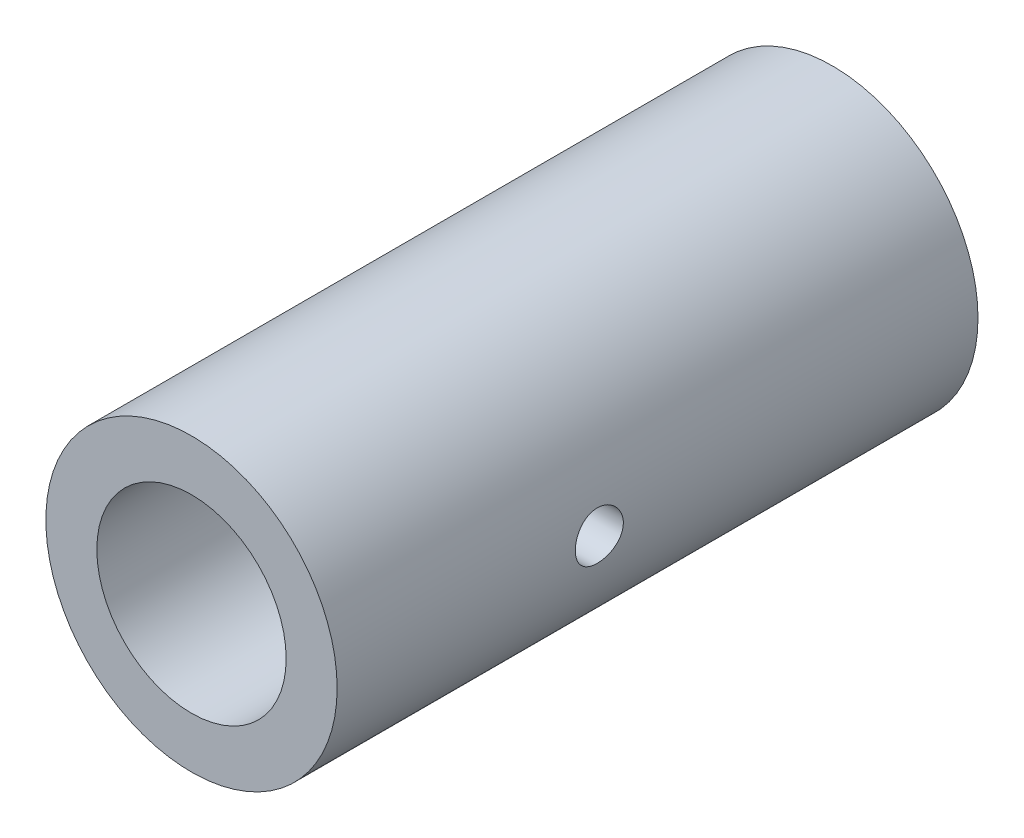
ISO-10303-21;
HEADER;
FILE_DESCRIPTION(('STEP AP214'),'2;1');
FILE_NAME('part.step','',(''),(''),'','','');
FILE_SCHEMA(('AUTOMOTIVE_DESIGN { 1 0 10303 214 1 1 1 1 }'));
ENDSEC;
DATA;
#1=APPLICATION_CONTEXT('core data for automotive mechanical design processes');
#2=APPLICATION_PROTOCOL_DEFINITION('international standard','automotive_design',2000,#1);
#3=PRODUCT_CONTEXT('',#1,'mechanical');
#4=PRODUCT('Part','Part','',(#3));
#5=PRODUCT_RELATED_PRODUCT_CATEGORY('part','',(#4));
#6=PRODUCT_DEFINITION_FORMATION('','',#4);
#7=PRODUCT_DEFINITION_CONTEXT('part definition',#1,'design');
#8=PRODUCT_DEFINITION('design','',#6,#7);
#9=PRODUCT_DEFINITION_SHAPE('','',#8);
#10=(LENGTH_UNIT() NAMED_UNIT(*) SI_UNIT(.MILLI.,.METRE.));
#11=(NAMED_UNIT(*) PLANE_ANGLE_UNIT() SI_UNIT($,.RADIAN.));
#12=(NAMED_UNIT(*) SI_UNIT($,.STERADIAN.) SOLID_ANGLE_UNIT());
#13=UNCERTAINTY_MEASURE_WITH_UNIT(LENGTH_MEASURE(1.E-05),#10,'distance_accuracy_value','');
#14=(GEOMETRIC_REPRESENTATION_CONTEXT(3) GLOBAL_UNCERTAINTY_ASSIGNED_CONTEXT((#13)) GLOBAL_UNIT_ASSIGNED_CONTEXT((#10,
#11,#12)) REPRESENTATION_CONTEXT('',''));
#15=CARTESIAN_POINT('',(0.,0.,0.));
#16=DIRECTION('',(0.,0.,1.));
#17=DIRECTION('',(1.,0.,0.));
#18=AXIS2_PLACEMENT_3D('',#15,#16,#17);
#19=CARTESIAN_POINT('',(0.,0.,44.));
#20=DIRECTION('',(0.,0.,-1.));
#21=DIRECTION('',(-1.,0.,0.));
#22=AXIS2_PLACEMENT_3D('',#19,#20,#21);
#23=CYLINDRICAL_SURFACE('',#22,10.);
#24=CARTESIAN_POINT('',(10.,0.,27.65));
#25=CARTESIAN_POINT('',(9.99999843258099,0.092011453105751,27.6499962990147));
#26=CARTESIAN_POINT('',(9.99871684765511,0.184073454347172,27.6422775413146));
#27=CARTESIAN_POINT('',(9.99372775496381,0.365616322535328,27.6116187648621));
#28=CARTESIAN_POINT('',(9.9900180027216,0.455094721351767,27.5886646630412));
#29=CARTESIAN_POINT('',(9.98058875631552,0.628817487751612,27.5282463610641));
#30=CARTESIAN_POINT('',(9.974870893487,0.713066038744482,27.4907939364397));
#31=CARTESIAN_POINT('',(9.96205444853338,0.874072236504037,27.4024727458514));
#32=CARTESIAN_POINT('',(9.95495602786423,0.950830757653324,27.351605548495));
#33=CARTESIAN_POINT('',(9.9400912001718,1.09540879372212,27.2373912228671));
#34=CARTESIAN_POINT('',(9.93231968689365,1.16314787882339,27.1739429363817));
#35=CARTESIAN_POINT('',(9.9170237472334,1.28706950777735,27.0365852264068));
#36=CARTESIAN_POINT('',(9.90949933632427,1.34325132909588,26.9626751493568));
#37=CARTESIAN_POINT('',(9.89550007731641,1.44278500045253,26.8059406563233));
#38=CARTESIAN_POINT('',(9.88903182722124,1.48605749570898,26.7230652056561));
#39=CARTESIAN_POINT('',(9.87794796970923,1.55803674048924,26.5510973747635));
#40=CARTESIAN_POINT('',(9.8733322397089,1.58674445381555,26.4620054063507));
#41=CARTESIAN_POINT('',(9.86652679242373,1.62852619503009,26.280985417999));
#42=CARTESIAN_POINT('',(9.86431555933323,1.64173895927951,26.1890902443212));
#43=CARTESIAN_POINT('',(9.86250435770823,1.65258585530686,26.0043626340766));
#44=CARTESIAN_POINT('',(9.86290420804218,1.65022106770359,25.9115302629694));
#45=CARTESIAN_POINT('',(9.86625034802632,1.63009303176277,25.7285527229433));
#46=CARTESIAN_POINT('',(9.86917088684506,1.61248549472487,25.6383898859726));
#47=CARTESIAN_POINT('',(9.87718903199043,1.56261607367809,25.4623159294666));
#48=CARTESIAN_POINT('',(9.88228671162733,1.53035369619838,25.3764049532117));
#49=CARTESIAN_POINT('',(9.89411264039674,1.45193210975571,25.2108064700756));
#50=CARTESIAN_POINT('',(9.90084846298694,1.4057081060585,25.1311502107593));
#51=CARTESIAN_POINT('',(9.9151864393107,1.30072141548377,24.9806656760923));
#52=CARTESIAN_POINT('',(9.92278866158316,1.24195773629986,24.9098381000877));
#53=CARTESIAN_POINT('',(9.93811607123993,1.11271072676602,24.7781200211173));
#54=CARTESIAN_POINT('',(9.94584163094155,1.04209376928223,24.7173606053701));
#55=CARTESIAN_POINT('',(9.96045987838133,0.891597059898564,24.6085339783937));
#56=CARTESIAN_POINT('',(9.9673525609492,0.811717250503356,24.5604668459529));
#57=CARTESIAN_POINT('',(9.97953794169528,0.644840083170753,24.4783778494657));
#58=CARTESIAN_POINT('',(9.98482933722619,0.557837003156559,24.444367412362));
#59=CARTESIAN_POINT('',(9.99320544362233,0.379246930002471,24.3914780872247));
#60=CARTESIAN_POINT('',(9.99629033536768,0.287660313260821,24.3725979588552));
#61=CARTESIAN_POINT('',(9.99988156603306,0.103632983819161,24.3506825388388));
#62=CARTESIAN_POINT('',(10.0004171933872,0.0112142564118359,24.3474672638785));
#63=CARTESIAN_POINT('',(9.99892971175882,-0.17284150555468,24.3564931986803));
#64=CARTESIAN_POINT('',(9.99690669920295,-0.264478569441162,24.3687338259605));
#65=CARTESIAN_POINT('',(9.99054737820398,-0.443814955541767,24.4081744027771));
#66=CARTESIAN_POINT('',(9.98622483070291,-0.5315343719383,24.4352853943084));
#67=CARTESIAN_POINT('',(9.97574921956607,-0.70118295929459,24.5036023925551));
#68=CARTESIAN_POINT('',(9.96959605484327,-0.783111810188987,24.5448091776617));
#69=CARTESIAN_POINT('',(9.95606928426946,-0.939636398877248,24.640561319499));
#70=CARTESIAN_POINT('',(9.94868555427359,-1.01416235726447,24.6952192859171));
#71=CARTESIAN_POINT('',(9.93354765732487,-1.15304841333208,24.8161671490688));
#72=CARTESIAN_POINT('',(9.92579346406183,-1.21740778758216,24.8824578728543));
#73=CARTESIAN_POINT('',(9.91069407401676,-1.33479962911471,25.0255961063283));
#74=CARTESIAN_POINT('',(9.90335382329476,-1.38771058951943,25.1025438710988));
#75=CARTESIAN_POINT('',(9.89000528724129,-1.47985547415616,25.2643410470675));
#76=CARTESIAN_POINT('',(9.88399696030451,-1.51908982562647,25.3491902113319));
#77=CARTESIAN_POINT('',(9.87402953570153,-1.58258535747086,25.5240395324032));
#78=CARTESIAN_POINT('',(9.87006212213643,-1.60690737863648,25.6140170997967));
#79=CARTESIAN_POINT('',(9.86460473721113,-1.64007952798875,25.7968513117806));
#80=CARTESIAN_POINT('',(9.86311455516768,-1.64893097191818,25.8897077108482));
#81=CARTESIAN_POINT('',(9.86278931217107,-1.65087457438795,26.0744506413018));
#82=CARTESIAN_POINT('',(9.86392203182987,-1.64415796786953,26.1663351601921));
#83=CARTESIAN_POINT('',(9.86864441177183,-1.61556925478546,26.3476477518639));
#84=CARTESIAN_POINT('',(9.87223406454433,-1.59369719454886,26.4370758321536));
#85=CARTESIAN_POINT('',(9.88145370519205,-1.53549112071356,26.6108652424354));
#86=CARTESIAN_POINT('',(9.88708141498759,-1.49917324977365,26.695232107451));
#87=CARTESIAN_POINT('',(9.89974533231771,-1.41312606218934,26.8567062668603));
#88=CARTESIAN_POINT('',(9.90678160742252,-1.36339610211421,26.9338132127277));
#89=CARTESIAN_POINT('',(9.92157214136343,-1.25125259966706,27.0795454976377));
#90=CARTESIAN_POINT('',(9.92933379899765,-1.18869826623126,27.1480617598196));
#91=CARTESIAN_POINT('',(9.94464125601211,-1.05297867490409,27.2736905998767));
#92=CARTESIAN_POINT('',(9.95218700513286,-0.979810970092669,27.3308005407802));
#93=CARTESIAN_POINT('',(9.96627143049842,-0.824354696103044,27.4323474225735));
#94=CARTESIAN_POINT('',(9.97280295936929,-0.742007852048185,27.476696147978));
#95=CARTESIAN_POINT('',(9.98405342047581,-0.570959586923793,27.5508633528063));
#96=CARTESIAN_POINT('',(9.98877416450827,-0.482264623543761,27.5806963641252));
#97=CARTESIAN_POINT('',(9.99483601455804,-0.327682758240928,27.6184793415268));
#98=CARTESIAN_POINT('',(9.99676220083327,-0.2627330667111,27.6302807488145));
#99=CARTESIAN_POINT('',(9.99934474465587,-0.131864227625941,27.6460423389331));
#100=CARTESIAN_POINT('',(10.0000011233775,-0.0659450962546689,27.6500026525158));
#101=CARTESIAN_POINT('',(10.,0.,27.65));
#102=B_SPLINE_CURVE_WITH_KNOTS('',3,(#24,#25,#26,#27,#28,#29,#30,#31,#32,#33,#34,#35,#36,#37,
#38,#39,#40,#41,#42,#43,#44,#45,#46,#47,#48,#49,#50,#51,#52,#53,#54,#55,#56,#57,#58,#59,#60,#61,
#62,#63,#64,#65,#66,#67,#68,#69,#70,#71,#72,#73,#74,#75,#76,#77,#78,#79,#80,#81,#82,#83,#84,#85,
#86,#87,#88,#89,#90,#91,#92,#93,#94,#95,#96,#97,#98,#99,#100,#101),.UNSPECIFIED.,.T.,.F.,(4,2,2,
2,2,2,2,2,2,2,2,2,2,2,2,2,2,2,2,2,2,2,2,2,2,2,2,2,2,2,2,2,2,2,2,2,2,2,4),(0.,0.275793319008917,
0.551841928312971,0.827666799870594,1.1034594331417,1.38156673144315,1.65969141110741,
1.93949209608633,2.21927426326044,2.49653175525206,2.77377001402269,3.04820914252877,
3.32265751287871,3.59839967320041,3.87416366201706,4.1532757240192,4.43238951858747,
4.71172976565331,4.991047110928,5.26714751096616,5.54323750600189,5.81769359979003,
6.09216485190802,6.36901711215385,6.64588906369257,6.92556925596458,7.20524071063227,
7.48376340648032,7.76226241335695,8.03735855216244,8.31245385002402,8.58724259883658,
8.86204453269315,9.14004258759616,9.4181048373113,9.69804546871317,9.9777052678328,
10.1753710978727,10.3730336317698),.UNSPECIFIED.);
#103=CARTESIAN_POINT('',(10.,0.,27.65));
#104=VERTEX_POINT('',#103);
#105=EDGE_CURVE('E11',#104,#104,#102,.T.);
#106=ORIENTED_EDGE('',*,*,#105,.T.);
#107=EDGE_LOOP('',(#106));
#108=FACE_BOUND('',#107,.T.);
#109=CARTESIAN_POINT('',(-10.,0.,27.65));
#110=CARTESIAN_POINT('',(-9.99999843258099,-0.092011453105751,27.6499962990147));
#111=CARTESIAN_POINT('',(-9.99871684765511,-0.184073454347172,27.6422775413146));
#112=CARTESIAN_POINT('',(-9.99372775496381,-0.365616322535328,27.6116187648621));
#113=CARTESIAN_POINT('',(-9.9900180027216,-0.455094721351767,27.5886646630412));
#114=CARTESIAN_POINT('',(-9.98058875631552,-0.628817487751612,27.5282463610641));
#115=CARTESIAN_POINT('',(-9.974870893487,-0.713066038744482,27.4907939364397));
#116=CARTESIAN_POINT('',(-9.96205444853338,-0.874072236504037,27.4024727458514));
#117=CARTESIAN_POINT('',(-9.95495602786423,-0.950830757653324,27.351605548495));
#118=CARTESIAN_POINT('',(-9.9400912001718,-1.09540879372212,27.2373912228671));
#119=CARTESIAN_POINT('',(-9.93231968689365,-1.16314787882339,27.1739429363817));
#120=CARTESIAN_POINT('',(-9.9170237472334,-1.28706950777735,27.0365852264068));
#121=CARTESIAN_POINT('',(-9.90949933632427,-1.34325132909588,26.9626751493568));
#122=CARTESIAN_POINT('',(-9.89550007731641,-1.44278500045253,26.8059406563233));
#123=CARTESIAN_POINT('',(-9.88903182722124,-1.48605749570898,26.7230652056561));
#124=CARTESIAN_POINT('',(-9.87794796970923,-1.55803674048924,26.5510973747635));
#125=CARTESIAN_POINT('',(-9.8733322397089,-1.58674445381555,26.4620054063507));
#126=CARTESIAN_POINT('',(-9.86652679242373,-1.62852619503009,26.280985417999));
#127=CARTESIAN_POINT('',(-9.86431555933323,-1.64173895927951,26.1890902443212));
#128=CARTESIAN_POINT('',(-9.86250435770823,-1.65258585530686,26.0043626340766));
#129=CARTESIAN_POINT('',(-9.86290420804218,-1.65022106770359,25.9115302629694));
#130=CARTESIAN_POINT('',(-9.86625034802632,-1.63009303176277,25.7285527229433));
#131=CARTESIAN_POINT('',(-9.86917088684506,-1.61248549472487,25.6383898859726));
#132=CARTESIAN_POINT('',(-9.87718903199043,-1.56261607367809,25.4623159294666));
#133=CARTESIAN_POINT('',(-9.88228671162733,-1.53035369619838,25.3764049532117));
#134=CARTESIAN_POINT('',(-9.89411264039674,-1.45193210975571,25.2108064700756));
#135=CARTESIAN_POINT('',(-9.90084846298694,-1.4057081060585,25.1311502107593));
#136=CARTESIAN_POINT('',(-9.9151864393107,-1.30072141548377,24.9806656760923));
#137=CARTESIAN_POINT('',(-9.92278866158316,-1.24195773629986,24.9098381000877));
#138=CARTESIAN_POINT('',(-9.93811607123993,-1.11271072676602,24.7781200211173));
#139=CARTESIAN_POINT('',(-9.94584163094155,-1.04209376928223,24.7173606053701));
#140=CARTESIAN_POINT('',(-9.96045987838133,-0.891597059898564,24.6085339783937));
#141=CARTESIAN_POINT('',(-9.9673525609492,-0.811717250503356,24.5604668459529));
#142=CARTESIAN_POINT('',(-9.97953794169528,-0.644840083170753,24.4783778494657));
#143=CARTESIAN_POINT('',(-9.98482933722619,-0.557837003156559,24.444367412362));
#144=CARTESIAN_POINT('',(-9.99320544362233,-0.379246930002471,24.3914780872247));
#145=CARTESIAN_POINT('',(-9.99629033536768,-0.287660313260821,24.3725979588552));
#146=CARTESIAN_POINT('',(-9.99988156603306,-0.103632983819161,24.3506825388388));
#147=CARTESIAN_POINT('',(-10.0004171933872,-0.0112142564118359,24.3474672638785));
#148=CARTESIAN_POINT('',(-9.99892971175882,0.17284150555468,24.3564931986803));
#149=CARTESIAN_POINT('',(-9.99690669920295,0.264478569441162,24.3687338259605));
#150=CARTESIAN_POINT('',(-9.99054737820398,0.443814955541767,24.4081744027771));
#151=CARTESIAN_POINT('',(-9.98622483070291,0.5315343719383,24.4352853943084));
#152=CARTESIAN_POINT('',(-9.97574921956607,0.70118295929459,24.5036023925551));
#153=CARTESIAN_POINT('',(-9.96959605484327,0.783111810188987,24.5448091776617));
#154=CARTESIAN_POINT('',(-9.95606928426946,0.939636398877248,24.640561319499));
#155=CARTESIAN_POINT('',(-9.94868555427359,1.01416235726447,24.6952192859171));
#156=CARTESIAN_POINT('',(-9.93354765732487,1.15304841333208,24.8161671490688));
#157=CARTESIAN_POINT('',(-9.92579346406183,1.21740778758216,24.8824578728543));
#158=CARTESIAN_POINT('',(-9.91069407401676,1.33479962911471,25.0255961063283));
#159=CARTESIAN_POINT('',(-9.90335382329476,1.38771058951943,25.1025438710988));
#160=CARTESIAN_POINT('',(-9.89000528724129,1.47985547415616,25.2643410470675));
#161=CARTESIAN_POINT('',(-9.88399696030451,1.51908982562647,25.3491902113319));
#162=CARTESIAN_POINT('',(-9.87402953570153,1.58258535747086,25.5240395324032));
#163=CARTESIAN_POINT('',(-9.87006212213643,1.60690737863648,25.6140170997967));
#164=CARTESIAN_POINT('',(-9.86460473721113,1.64007952798875,25.7968513117806));
#165=CARTESIAN_POINT('',(-9.86311455516768,1.64893097191818,25.8897077108482));
#166=CARTESIAN_POINT('',(-9.86278931217107,1.65087457438795,26.0744506413018));
#167=CARTESIAN_POINT('',(-9.86392203182987,1.64415796786953,26.1663351601921));
#168=CARTESIAN_POINT('',(-9.86864441177183,1.61556925478546,26.3476477518639));
#169=CARTESIAN_POINT('',(-9.87223406454433,1.59369719454886,26.4370758321536));
#170=CARTESIAN_POINT('',(-9.88145370519205,1.53549112071356,26.6108652424354));
#171=CARTESIAN_POINT('',(-9.88708141498759,1.49917324977365,26.695232107451));
#172=CARTESIAN_POINT('',(-9.89974533231771,1.41312606218934,26.8567062668603));
#173=CARTESIAN_POINT('',(-9.90678160742252,1.36339610211421,26.9338132127277));
#174=CARTESIAN_POINT('',(-9.92157214136343,1.25125259966706,27.0795454976377));
#175=CARTESIAN_POINT('',(-9.92933379899765,1.18869826623126,27.1480617598196));
#176=CARTESIAN_POINT('',(-9.94464125601211,1.05297867490409,27.2736905998767));
#177=CARTESIAN_POINT('',(-9.95218700513286,0.979810970092669,27.3308005407802));
#178=CARTESIAN_POINT('',(-9.96627143049842,0.824354696103044,27.4323474225735));
#179=CARTESIAN_POINT('',(-9.97280295936929,0.742007852048185,27.476696147978));
#180=CARTESIAN_POINT('',(-9.98405342047581,0.570959586923793,27.5508633528063));
#181=CARTESIAN_POINT('',(-9.98877416450827,0.482264623543761,27.5806963641252));
#182=CARTESIAN_POINT('',(-9.99483601455804,0.327682758240928,27.6184793415268));
#183=CARTESIAN_POINT('',(-9.99676220083327,0.2627330667111,27.6302807488145));
#184=CARTESIAN_POINT('',(-9.99934474465587,0.131864227625941,27.6460423389331));
#185=CARTESIAN_POINT('',(-10.0000011233775,0.0659450962546689,27.6500026525158));
#186=CARTESIAN_POINT('',(-10.,0.,27.65));
#187=B_SPLINE_CURVE_WITH_KNOTS('',3,(#109,#110,#111,#112,#113,#114,#115,#116,#117,#118,#119,
#120,#121,#122,#123,#124,#125,#126,#127,#128,#129,#130,#131,#132,#133,#134,#135,#136,#137,#138,
#139,#140,#141,#142,#143,#144,#145,#146,#147,#148,#149,#150,#151,#152,#153,#154,#155,#156,#157,
#158,#159,#160,#161,#162,#163,#164,#165,#166,#167,#168,#169,#170,#171,#172,#173,#174,#175,#176,
#177,#178,#179,#180,#181,#182,#183,#184,#185,#186),.UNSPECIFIED.,.T.,.F.,(4,2,2,2,2,2,2,2,2,2,2,
2,2,2,2,2,2,2,2,2,2,2,2,2,2,2,2,2,2,2,2,2,2,2,2,2,2,2,4),(0.,0.275793319008917,
0.551841928312971,0.827666799870594,1.1034594331417,1.38156673144315,1.65969141110741,
1.93949209608633,2.21927426326044,2.49653175525206,2.77377001402269,3.04820914252877,
3.32265751287871,3.59839967320041,3.87416366201706,4.1532757240192,4.43238951858747,
4.71172976565331,4.991047110928,5.26714751096616,5.54323750600189,5.81769359979003,
6.09216485190802,6.36901711215385,6.64588906369257,6.92556925596458,7.20524071063227,
7.48376340648032,7.76226241335695,8.03735855216244,8.31245385002402,8.58724259883658,
8.86204453269315,9.14004258759616,9.4181048373113,9.69804546871317,9.9777052678328,
10.1753710978727,10.3730336317698),.UNSPECIFIED.);
#188=CARTESIAN_POINT('',(-10.,0.,27.65));
#189=VERTEX_POINT('',#188);
#190=EDGE_CURVE('E50',#189,#189,#187,.T.);
#191=ORIENTED_EDGE('',*,*,#190,.T.);
#192=EDGE_LOOP('',(#191));
#193=FACE_BOUND('',#192,.T.);
#194=CARTESIAN_POINT('',(0.,0.,44.));
#195=DIRECTION('',(0.,0.,1.));
#196=DIRECTION('',(1.,0.,0.));
#197=AXIS2_PLACEMENT_3D('',#194,#195,#196);
#198=CIRCLE('',#197,10.);
#199=CARTESIAN_POINT('',(10.,0.,44.));
#200=VERTEX_POINT('',#199);
#201=EDGE_CURVE('E126',#200,#200,#198,.T.);
#202=ORIENTED_EDGE('',*,*,#201,.F.);
#203=EDGE_LOOP('',(#202));
#204=FACE_BOUND('',#203,.T.);
#205=CARTESIAN_POINT('',(0.,0.,0.));
#206=DIRECTION('',(0.,0.,1.));
#207=DIRECTION('',(1.,0.,0.));
#208=AXIS2_PLACEMENT_3D('',#205,#206,#207);
#209=CIRCLE('',#208,10.);
#210=CARTESIAN_POINT('',(10.,0.,0.));
#211=VERTEX_POINT('',#210);
#212=EDGE_CURVE('E127',#211,#211,#209,.T.);
#213=ORIENTED_EDGE('',*,*,#212,.T.);
#214=EDGE_LOOP('',(#213));
#215=FACE_BOUND('',#214,.T.);
#216=ADVANCED_FACE('F39',(#108,#193,#204,#215),#23,.T.);
#217=CARTESIAN_POINT('',(0.,0.,44.));
#218=DIRECTION('',(0.,0.,1.));
#219=DIRECTION('',(1.,0.,0.));
#220=AXIS2_PLACEMENT_3D('',#217,#218,#219);
#221=PLANE('',#220);
#222=CARTESIAN_POINT('',(0.,0.,44.));
#223=DIRECTION('',(0.,0.,1.));
#224=DIRECTION('',(1.,0.,0.));
#225=AXIS2_PLACEMENT_3D('',#222,#223,#224);
#226=CIRCLE('',#225,6.5);
#227=CARTESIAN_POINT('',(6.5,0.,44.));
#228=VERTEX_POINT('',#227);
#229=EDGE_CURVE('E133',#228,#228,#226,.T.);
#230=ORIENTED_EDGE('',*,*,#229,.F.);
#231=EDGE_LOOP('',(#230));
#232=FACE_BOUND('',#231,.T.);
#233=ORIENTED_EDGE('',*,*,#201,.T.);
#234=EDGE_LOOP('',(#233));
#235=FACE_BOUND('',#234,.T.);
#236=ADVANCED_FACE('F145',(#232,#235),#221,.T.);
#237=CARTESIAN_POINT('',(0.,0.,0.));
#238=DIRECTION('',(0.,0.,1.));
#239=DIRECTION('',(1.,0.,0.));
#240=AXIS2_PLACEMENT_3D('',#237,#238,#239);
#241=PLANE('',#240);
#242=CARTESIAN_POINT('',(4.24264068711931,4.24264068711926,0.));
#243=DIRECTION('',(0.,0.,-1.));
#244=DIRECTION('',(-1.,0.,0.));
#245=AXIS2_PLACEMENT_3D('',#242,#243,#244);
#246=CIRCLE('',#245,1.24999999999999);
#247=CARTESIAN_POINT('',(2.99264068711932,4.24264068711926,0.));
#248=VERTEX_POINT('',#247);
#249=EDGE_CURVE('E74',#248,#248,#246,.T.);
#250=ORIENTED_EDGE('',*,*,#249,.F.);
#251=EDGE_LOOP('',(#250));
#252=FACE_BOUND('',#251,.T.);
#253=CARTESIAN_POINT('',(-4.24264068711928,4.24264068711929,0.));
#254=DIRECTION('',(0.,0.,-1.));
#255=DIRECTION('',(-1.,0.,0.));
#256=AXIS2_PLACEMENT_3D('',#253,#254,#255);
#257=CIRCLE('',#256,1.24999999999999);
#258=CARTESIAN_POINT('',(-5.49264068711927,4.24264068711929,0.));
#259=VERTEX_POINT('',#258);
#260=EDGE_CURVE('E73',#259,#259,#257,.T.);
#261=ORIENTED_EDGE('',*,*,#260,.F.);
#262=EDGE_LOOP('',(#261));
#263=FACE_BOUND('',#262,.T.);
#264=CARTESIAN_POINT('',(-4.24264068711931,-4.24264068711926,0.));
#265=DIRECTION('',(0.,0.,-1.));
#266=DIRECTION('',(-1.,0.,0.));
#267=AXIS2_PLACEMENT_3D('',#264,#265,#266);
#268=CIRCLE('',#267,1.24999999999999);
#269=CARTESIAN_POINT('',(-5.4926406871193,-4.24264068711926,0.));
#270=VERTEX_POINT('',#269);
#271=EDGE_CURVE('E84',#270,#270,#268,.T.);
#272=ORIENTED_EDGE('',*,*,#271,.F.);
#273=EDGE_LOOP('',(#272));
#274=FACE_BOUND('',#273,.T.);
#275=CARTESIAN_POINT('',(4.24264068711931,-4.24264068711926,0.));
#276=DIRECTION('',(0.,0.,-1.));
#277=DIRECTION('',(-1.,0.,0.));
#278=AXIS2_PLACEMENT_3D('',#275,#276,#277);
#279=CIRCLE('',#278,1.24999999999999);
#280=CARTESIAN_POINT('',(2.99264068711932,-4.24264068711926,0.));
#281=VERTEX_POINT('',#280);
#282=EDGE_CURVE('E90',#281,#281,#279,.T.);
#283=ORIENTED_EDGE('',*,*,#282,.F.);
#284=EDGE_LOOP('',(#283));
#285=FACE_BOUND('',#284,.T.);
#286=ORIENTED_EDGE('',*,*,#212,.F.);
#287=EDGE_LOOP('',(#286));
#288=FACE_BOUND('',#287,.T.);
#289=ADVANCED_FACE('F141',(#252,#263,#274,#285,#288),#241,.F.);
#290=CARTESIAN_POINT('',(0.,0.,17.));
#291=DIRECTION('',(0.,0.,1.));
#292=DIRECTION('',(1.,0.,0.));
#293=AXIS2_PLACEMENT_3D('',#290,#291,#292);
#294=CYLINDRICAL_SURFACE('',#293,6.5);
#295=CARTESIAN_POINT('',(6.5,0.,24.35));
#296=CARTESIAN_POINT('',(6.49999849148033,0.091117750385873,24.3500024728557));
#297=CARTESIAN_POINT('',(6.4980650151015,0.182262858095386,24.3575730489732));
#298=CARTESIAN_POINT('',(6.49053943796148,0.361937820756667,24.3876081189059));
#299=CARTESIAN_POINT('',(6.48494533438108,0.450466216312032,24.4100807661009));
#300=CARTESIAN_POINT('',(6.47071750795578,0.622287397419872,24.4691501465638));
#301=CARTESIAN_POINT('',(6.46208749750639,0.705586431636938,24.5057296348101));
#302=CARTESIAN_POINT('',(6.44270535969817,0.864866150834566,24.5919129291593));
#303=CARTESIAN_POINT('',(6.43195314475064,0.940846533563348,24.6415172728585));
#304=CARTESIAN_POINT('',(6.40923777941342,1.08494165624619,24.7534519884888));
#305=CARTESIAN_POINT('',(6.39725548483155,1.15287927915146,24.8160064906181));
#306=CARTESIAN_POINT('',(6.37355665387332,1.2774205628457,24.9515861365439));
#307=CARTESIAN_POINT('',(6.36184014855969,1.33402290487283,25.0246124969565));
#308=CARTESIAN_POINT('',(6.33980584668286,1.43512676812557,25.1804468293445));
#309=CARTESIAN_POINT('',(6.32951232072088,1.47942889215841,25.2633879127794));
#310=CARTESIAN_POINT('',(6.31176915976443,1.55339199639589,25.4358440605568));
#311=CARTESIAN_POINT('',(6.3043190546097,1.58305539735461,25.5253580351489));
#312=CARTESIAN_POINT('',(6.29330322679465,1.62629233475193,25.7064682160975));
#313=CARTESIAN_POINT('',(6.28966059809192,1.64018493928543,25.7979834628086));
#314=CARTESIAN_POINT('',(6.28644204901193,1.65247997744377,25.9821125874049));
#315=CARTESIAN_POINT('',(6.28686544513413,1.65088501453495,26.0747262780269));
#316=CARTESIAN_POINT('',(6.29166204403964,1.63250447801232,26.25596788098));
#317=CARTESIAN_POINT('',(6.29593604050051,1.61610042228528,26.3446375220669));
#318=CARTESIAN_POINT('',(6.30779399869364,1.56917650684075,26.517923133797));
#319=CARTESIAN_POINT('',(6.31537820273062,1.53865561377152,26.6025388071895));
#320=CARTESIAN_POINT('',(6.33309221869858,1.46404250493563,26.766331127128));
#321=CARTESIAN_POINT('',(6.34324760249032,1.41981289361812,26.845442303318));
#322=CARTESIAN_POINT('',(6.364945442261,1.31913389984381,26.9952560597186));
#323=CARTESIAN_POINT('',(6.37648814769664,1.26268231826682,27.0659571231313));
#324=CARTESIAN_POINT('',(6.40007669661782,1.13719136135146,27.1991285860165));
#325=CARTESIAN_POINT('',(6.41212734929307,1.06783038255625,27.2612954691906));
#326=CARTESIAN_POINT('',(6.43506800190513,0.919522532515228,27.3731738115113));
#327=CARTESIAN_POINT('',(6.4459579641844,0.840575350431438,27.4228848666105));
#328=CARTESIAN_POINT('',(6.4654072019095,0.674894732770336,27.5085568476893));
#329=CARTESIAN_POINT('',(6.47395787369381,0.588134074053324,27.5444672069956));
#330=CARTESIAN_POINT('',(6.48770263023884,0.409541718403764,27.6011079414884));
#331=CARTESIAN_POINT('',(6.49289737755419,0.317711026327973,27.6218413131502));
#332=CARTESIAN_POINT('',(6.49924644511166,0.134179279177318,27.6470730639133));
#333=CARTESIAN_POINT('',(6.5005035683198,0.0425384989604856,27.6519846164781));
#334=CARTESIAN_POINT('',(6.4991291685556,-0.140255983188984,27.646568292535));
#335=CARTESIAN_POINT('',(6.49649800722503,-0.231409729628335,27.6362418332851));
#336=CARTESIAN_POINT('',(6.48770867929811,-0.409198092309221,27.6009828268995));
#337=CARTESIAN_POINT('',(6.48160524971031,-0.495880588598901,27.5762768233606));
#338=CARTESIAN_POINT('',(6.46656022798463,-0.663865402904554,27.5132197757114));
#339=CARTESIAN_POINT('',(6.45761834418719,-0.745167166996455,27.4748673293398));
#340=CARTESIAN_POINT('',(6.4376432610754,-0.901717887469286,27.3848131215947));
#341=CARTESIAN_POINT('',(6.42657501104735,-0.976830003962305,27.3328814403868));
#342=CARTESIAN_POINT('',(6.40362831883756,-1.11741986610505,27.2174356933685));
#343=CARTESIAN_POINT('',(6.39174973250325,-1.18289589099312,27.1539195633931));
#344=CARTESIAN_POINT('',(6.36814923136526,-1.30406635448273,27.0151871681675));
#345=CARTESIAN_POINT('',(6.35643893296219,-1.35947055793743,26.9397149948231));
#346=CARTESIAN_POINT('',(6.33483594517711,-1.45682878188372,26.7803018738935));
#347=CARTESIAN_POINT('',(6.32494317580465,-1.49878339435969,26.6963612992591));
#348=CARTESIAN_POINT('',(6.30820564851897,-1.56773755394613,26.5228391000664));
#349=CARTESIAN_POINT('',(6.30134291296739,-1.59482554658986,26.433294447436));
#350=CARTESIAN_POINT('',(6.29142787777632,-1.63350588726022,26.2507202857376));
#351=CARTESIAN_POINT('',(6.28837471379837,-1.64510175027641,26.1576915720897));
#352=CARTESIAN_POINT('',(6.28649183842141,-1.65228074681225,25.9737474217869));
#353=CARTESIAN_POINT('',(6.28753962152452,-1.64832832798558,25.8828510800002));
#354=CARTESIAN_POINT('',(6.29345653429825,-1.62558916594653,25.7030665091789));
#355=CARTESIAN_POINT('',(6.29832558250899,-1.60680273895831,25.6141782373787));
#356=CARTESIAN_POINT('',(6.31126706173436,-1.55518610871843,25.4414559315372));
#357=CARTESIAN_POINT('',(6.31931901702728,-1.522445569368,25.3575934619621));
#358=CARTESIAN_POINT('',(6.3377213707967,-1.44392066335697,25.1964911275901));
#359=CARTESIAN_POINT('',(6.34807209772023,-1.3981344324715,25.1192522113504));
#360=CARTESIAN_POINT('',(6.37025290066772,-1.29337273284388,24.9713513057558));
#361=CARTESIAN_POINT('',(6.38211523105464,-1.23407618889245,24.9009215426855));
#362=CARTESIAN_POINT('',(6.40579298687251,-1.104599377756,24.7708609857974));
#363=CARTESIAN_POINT('',(6.41760840043669,-1.03441651710484,24.7112327726088));
#364=CARTESIAN_POINT('',(6.44012670826218,-0.883564094524526,24.6033709163432));
#365=CARTESIAN_POINT('',(6.45080446058256,-0.802721933411489,24.5553730088233));
#366=CARTESIAN_POINT('',(6.46957701766543,-0.633851244249666,24.473725188642));
#367=CARTESIAN_POINT('',(6.47767362922087,-0.545827797531966,24.4400652338716));
#368=CARTESIAN_POINT('',(6.48920819390174,-0.381665270886315,24.3929096326193));
#369=CARTESIAN_POINT('',(6.49322694643271,-0.306292143202492,24.37685387482));
#370=CARTESIAN_POINT('',(6.49862338093772,-0.15395243471393,24.3553984408158));
#371=CARTESIAN_POINT('',(6.50000127455811,-0.0769859821028003,24.349997910668));
#372=CARTESIAN_POINT('',(6.5,0.,24.35));
#373=B_SPLINE_CURVE_WITH_KNOTS('',3,(#295,#296,#297,#298,#299,#300,#301,#302,#303,#304,#305,
#306,#307,#308,#309,#310,#311,#312,#313,#314,#315,#316,#317,#318,#319,#320,#321,#322,#323,#324,
#325,#326,#327,#328,#329,#330,#331,#332,#333,#334,#335,#336,#337,#338,#339,#340,#341,#342,#343,
#344,#345,#346,#347,#348,#349,#350,#351,#352,#353,#354,#355,#356,#357,#358,#359,#360,#361,#362,
#363,#364,#365,#366,#367,#368,#369,#370,#371,#372),.UNSPECIFIED.,.T.,.F.,(4,2,2,2,2,2,2,2,2,2,2,
2,2,2,2,2,2,2,2,2,2,2,2,2,2,2,2,2,2,2,2,2,2,2,2,2,2,2,4),(0.,0.273071080673042,
0.546291690312231,0.819179352572713,1.09207827994795,1.37016840025651,1.64829085517239,
1.93068877591831,2.21303998185288,2.48957086262239,2.76605525924412,3.03561386213348,
3.30519219982154,3.57756487843309,3.84998660632106,4.13042684673474,4.41087618300892,
4.69234352388222,4.97375527812576,5.2477559758474,5.52173119090106,5.79150259377979,
6.06130172544542,6.33600366696576,6.61075460391991,6.89247457814753,7.17418215075421,
7.45419508187936,7.73414447043175,8.00579583650453,8.27744141180215,8.54736720344424,
8.81733158675163,9.09454331866243,9.37182119292241,9.65432089037335,9.93662240220947,
10.167360433645,10.398079972269),.UNSPECIFIED.);
#374=CARTESIAN_POINT('',(6.5,0.,24.35));
#375=VERTEX_POINT('',#374);
#376=EDGE_CURVE('E102',#375,#375,#373,.T.);
#377=ORIENTED_EDGE('',*,*,#376,.T.);
#378=EDGE_LOOP('',(#377));
#379=FACE_BOUND('',#378,.T.);
#380=CARTESIAN_POINT('',(-6.5,0.,27.65));
#381=CARTESIAN_POINT('',(-6.49999849148033,0.0911177503858729,27.6499975271442));
#382=CARTESIAN_POINT('',(-6.4980650151015,0.182262858095386,27.6424269510268));
#383=CARTESIAN_POINT('',(-6.49053943796148,0.361937820756667,27.6123918810941));
#384=CARTESIAN_POINT('',(-6.48494533438108,0.450466216312032,27.5899192338991));
#385=CARTESIAN_POINT('',(-6.47071750795578,0.622287397419872,27.5308498534362));
#386=CARTESIAN_POINT('',(-6.46208749750639,0.705586431636938,27.4942703651899));
#387=CARTESIAN_POINT('',(-6.44270535969817,0.864866150834566,27.4080870708407));
#388=CARTESIAN_POINT('',(-6.43195314475064,0.940846533563348,27.3584827271415));
#389=CARTESIAN_POINT('',(-6.40923777941342,1.08494165624619,27.2465480115112));
#390=CARTESIAN_POINT('',(-6.39725548483155,1.15287927915146,27.1839935093819));
#391=CARTESIAN_POINT('',(-6.37355665387332,1.2774205628457,27.0484138634561));
#392=CARTESIAN_POINT('',(-6.36184014855969,1.33402290487283,26.9753875030435));
#393=CARTESIAN_POINT('',(-6.33980584668286,1.43512676812557,26.8195531706555));
#394=CARTESIAN_POINT('',(-6.32951232072088,1.47942889215841,26.7366120872206));
#395=CARTESIAN_POINT('',(-6.31176915976443,1.55339199639589,26.5641559394432));
#396=CARTESIAN_POINT('',(-6.3043190546097,1.58305539735461,26.4746419648511));
#397=CARTESIAN_POINT('',(-6.29330322679465,1.62629233475193,26.2935317839025));
#398=CARTESIAN_POINT('',(-6.28966059809192,1.64018493928543,26.2020165371914));
#399=CARTESIAN_POINT('',(-6.28644204901193,1.65247997744377,26.0178874125951));
#400=CARTESIAN_POINT('',(-6.28686544513413,1.65088501453495,25.9252737219731));
#401=CARTESIAN_POINT('',(-6.29166204403964,1.63250447801232,25.74403211902));
#402=CARTESIAN_POINT('',(-6.29593604050051,1.61610042228528,25.6553624779331));
#403=CARTESIAN_POINT('',(-6.30779399869364,1.56917650684075,25.482076866203));
#404=CARTESIAN_POINT('',(-6.31537820273062,1.53865561377152,25.3974611928105));
#405=CARTESIAN_POINT('',(-6.33309221869858,1.46404250493563,25.233668872872));
#406=CARTESIAN_POINT('',(-6.34324760249032,1.41981289361812,25.154557696682));
#407=CARTESIAN_POINT('',(-6.364945442261,1.31913389984381,25.0047439402814));
#408=CARTESIAN_POINT('',(-6.37648814769664,1.26268231826682,24.9340428768687));
#409=CARTESIAN_POINT('',(-6.40007669661782,1.13719136135146,24.8008714139835));
#410=CARTESIAN_POINT('',(-6.41212734929307,1.06783038255625,24.7387045308094));
#411=CARTESIAN_POINT('',(-6.43506800190513,0.919522532515228,24.6268261884887));
#412=CARTESIAN_POINT('',(-6.4459579641844,0.840575350431438,24.5771151333895));
#413=CARTESIAN_POINT('',(-6.4654072019095,0.674894732770336,24.4914431523107));
#414=CARTESIAN_POINT('',(-6.47395787369381,0.588134074053324,24.4555327930044));
#415=CARTESIAN_POINT('',(-6.48770263023884,0.409541718403764,24.3988920585116));
#416=CARTESIAN_POINT('',(-6.49289737755419,0.317711026327973,24.3781586868498));
#417=CARTESIAN_POINT('',(-6.49924644511166,0.134179279177318,24.3529269360867));
#418=CARTESIAN_POINT('',(-6.5005035683198,0.0425384989604857,24.3480153835219));
#419=CARTESIAN_POINT('',(-6.4991291685556,-0.140255983188984,24.3534317074649));
#420=CARTESIAN_POINT('',(-6.49649800722503,-0.231409729628335,24.3637581667149));
#421=CARTESIAN_POINT('',(-6.48770867929811,-0.409198092309221,24.3990171731005));
#422=CARTESIAN_POINT('',(-6.48160524971031,-0.4958805885989,24.4237231766394));
#423=CARTESIAN_POINT('',(-6.46656022798463,-0.663865402904553,24.4867802242886));
#424=CARTESIAN_POINT('',(-6.45761834418719,-0.745167166996455,24.5251326706602));
#425=CARTESIAN_POINT('',(-6.4376432610754,-0.901717887469286,24.6151868784053));
#426=CARTESIAN_POINT('',(-6.42657501104735,-0.976830003962305,24.6671185596132));
#427=CARTESIAN_POINT('',(-6.40362831883756,-1.11741986610505,24.7825643066315));
#428=CARTESIAN_POINT('',(-6.39174973250325,-1.18289589099312,24.8460804366069));
#429=CARTESIAN_POINT('',(-6.36814923136526,-1.30406635448273,24.9848128318325));
#430=CARTESIAN_POINT('',(-6.35643893296219,-1.35947055793743,25.0602850051769));
#431=CARTESIAN_POINT('',(-6.33483594517711,-1.45682878188372,25.2196981261065));
#432=CARTESIAN_POINT('',(-6.32494317580465,-1.49878339435969,25.3036387007409));
#433=CARTESIAN_POINT('',(-6.30820564851897,-1.56773755394613,25.4771608999336));
#434=CARTESIAN_POINT('',(-6.30134291296739,-1.59482554658986,25.566705552564));
#435=CARTESIAN_POINT('',(-6.29142787777632,-1.63350588726022,25.7492797142624));
#436=CARTESIAN_POINT('',(-6.28837471379837,-1.64510175027641,25.8423084279103));
#437=CARTESIAN_POINT('',(-6.28649183842141,-1.65228074681225,26.0262525782131));
#438=CARTESIAN_POINT('',(-6.28753962152452,-1.64832832798558,26.1171489199998));
#439=CARTESIAN_POINT('',(-6.29345653429825,-1.62558916594653,26.2969334908211));
#440=CARTESIAN_POINT('',(-6.29832558250899,-1.60680273895831,26.3858217626212));
#441=CARTESIAN_POINT('',(-6.31126706173436,-1.55518610871843,26.5585440684628));
#442=CARTESIAN_POINT('',(-6.31931901702728,-1.52244556936801,26.6424065380379));
#443=CARTESIAN_POINT('',(-6.3377213707967,-1.44392066335697,26.8035088724099));
#444=CARTESIAN_POINT('',(-6.34807209772023,-1.3981344324715,26.8807477886496));
#445=CARTESIAN_POINT('',(-6.37025290066772,-1.29337273284388,27.0286486942442));
#446=CARTESIAN_POINT('',(-6.38211523105464,-1.23407618889245,27.0990784573145));
#447=CARTESIAN_POINT('',(-6.40579298687251,-1.104599377756,27.2291390142026));
#448=CARTESIAN_POINT('',(-6.41760840043669,-1.03441651710484,27.2887672273912));
#449=CARTESIAN_POINT('',(-6.44012670826218,-0.883564094524526,27.3966290836568));
#450=CARTESIAN_POINT('',(-6.45080446058256,-0.802721933411489,27.4446269911767));
#451=CARTESIAN_POINT('',(-6.46957701766543,-0.633851244249666,27.526274811358));
#452=CARTESIAN_POINT('',(-6.47767362922087,-0.545827797531966,27.5599347661284));
#453=CARTESIAN_POINT('',(-6.48920819390174,-0.381665270886315,27.6070903673807));
#454=CARTESIAN_POINT('',(-6.49322694643271,-0.306292143202492,27.62314612518));
#455=CARTESIAN_POINT('',(-6.49862338093772,-0.153952434713929,27.6446015591842));
#456=CARTESIAN_POINT('',(-6.50000127455811,-0.0769859821028001,27.650002089332));
#457=CARTESIAN_POINT('',(-6.5,0.,27.65));
#458=B_SPLINE_CURVE_WITH_KNOTS('',3,(#380,#381,#382,#383,#384,#385,#386,#387,#388,#389,#390,
#391,#392,#393,#394,#395,#396,#397,#398,#399,#400,#401,#402,#403,#404,#405,#406,#407,#408,#409,
#410,#411,#412,#413,#414,#415,#416,#417,#418,#419,#420,#421,#422,#423,#424,#425,#426,#427,#428,
#429,#430,#431,#432,#433,#434,#435,#436,#437,#438,#439,#440,#441,#442,#443,#444,#445,#446,#447,
#448,#449,#450,#451,#452,#453,#454,#455,#456,#457),.UNSPECIFIED.,.T.,.F.,(4,2,2,2,2,2,2,2,2,2,2,
2,2,2,2,2,2,2,2,2,2,2,2,2,2,2,2,2,2,2,2,2,2,2,2,2,2,2,4),(0.,0.273071080673042,
0.546291690312231,0.819179352572713,1.09207827994795,1.37016840025651,1.64829085517239,
1.93068877591831,2.21303998185288,2.48957086262238,2.76605525924412,3.03561386213348,
3.30519219982154,3.57756487843309,3.84998660632106,4.13042684673474,4.41087618300892,
4.69234352388222,4.97375527812576,5.2477559758474,5.52173119090106,5.79150259377979,
6.06130172544542,6.33600366696576,6.61075460391991,6.89247457814753,7.17418215075421,
7.45419508187936,7.73414447043175,8.00579583650453,8.27744141180215,8.54736720344424,
8.81733158675163,9.09454331866243,9.37182119292241,9.65432089037335,9.93662240220947,
10.167360433645,10.398079972269),.UNSPECIFIED.);
#459=CARTESIAN_POINT('',(-6.5,0.,27.65));
#460=VERTEX_POINT('',#459);
#461=EDGE_CURVE('E96',#460,#460,#458,.T.);
#462=ORIENTED_EDGE('',*,*,#461,.T.);
#463=EDGE_LOOP('',(#462));
#464=FACE_BOUND('',#463,.T.);
#465=CARTESIAN_POINT('',(0.,0.,17.));
#466=DIRECTION('',(0.,0.,1.));
#467=DIRECTION('',(1.,0.,0.));
#468=AXIS2_PLACEMENT_3D('',#465,#466,#467);
#469=CIRCLE('',#468,6.5);
#470=CARTESIAN_POINT('',(6.5,0.,17.));
#471=VERTEX_POINT('',#470);
#472=EDGE_CURVE('E130',#471,#471,#469,.T.);
#473=ORIENTED_EDGE('',*,*,#472,.F.);
#474=EDGE_LOOP('',(#473));
#475=FACE_BOUND('',#474,.T.);
#476=ORIENTED_EDGE('',*,*,#229,.T.);
#477=EDGE_LOOP('',(#476));
#478=FACE_BOUND('',#477,.T.);
#479=ADVANCED_FACE('F106',(#379,#464,#475,#478),#294,.F.);
#480=CARTESIAN_POINT('',(0.,0.,17.));
#481=DIRECTION('',(0.,0.,1.));
#482=DIRECTION('',(1.,0.,0.));
#483=AXIS2_PLACEMENT_3D('',#480,#481,#482);
#484=PLANE('',#483);
#485=ORIENTED_EDGE('',*,*,#472,.T.);
#486=EDGE_LOOP('',(#485));
#487=FACE_BOUND('',#486,.T.);
#488=ADVANCED_FACE('F118',(#487),#484,.T.);
#489=CARTESIAN_POINT('',(-10.,0.,26.));
#490=DIRECTION('',(-1.,0.,0.));
#491=DIRECTION('',(0.,0.,1.));
#492=AXIS2_PLACEMENT_3D('',#489,#490,#491);
#493=CYLINDRICAL_SURFACE('',#492,1.64999999999999);
#494=ORIENTED_EDGE('',*,*,#190,.F.);
#495=EDGE_LOOP('',(#494));
#496=FACE_BOUND('',#495,.T.);
#497=ORIENTED_EDGE('',*,*,#461,.F.);
#498=EDGE_LOOP('',(#497));
#499=FACE_BOUND('',#498,.T.);
#500=ADVANCED_FACE('F115',(#496,#499),#493,.F.);
#501=ORIENTED_EDGE('',*,*,#105,.F.);
#502=EDGE_LOOP('',(#501));
#503=FACE_BOUND('',#502,.T.);
#504=ORIENTED_EDGE('',*,*,#376,.F.);
#505=EDGE_LOOP('',(#504));
#506=FACE_BOUND('',#505,.T.);
#507=ADVANCED_FACE('F110',(#503,#506),#493,.F.);
#508=CARTESIAN_POINT('',(4.24264068711931,-4.24264068711926,8.49999999999999));
#509=DIRECTION('',(0.,0.,-1.));
#510=DIRECTION('',(-1.,0.,0.));
#511=AXIS2_PLACEMENT_3D('',#508,#509,#510);
#512=CONICAL_SURFACE('',#511,1.24999999999999,1.02974425867665);
#513=CARTESIAN_POINT('',(4.2426406871193,-4.24264068711926,9.25107577378444));
#514=VERTEX_POINT('',#513);
#515=VERTEX_LOOP('',#514);
#516=FACE_BOUND('',#515,.T.);
#517=CARTESIAN_POINT('',(4.24264068711931,-4.24264068711926,8.49999999999999));
#518=DIRECTION('',(0.,0.,-1.));
#519=DIRECTION('',(-1.,0.,0.));
#520=AXIS2_PLACEMENT_3D('',#517,#518,#519);
#521=CIRCLE('',#520,1.24999999999999);
#522=CARTESIAN_POINT('',(2.99264068711932,-4.24264068711926,8.49999999999999));
#523=VERTEX_POINT('',#522);
#524=EDGE_CURVE('E93',#523,#523,#521,.T.);
#525=ORIENTED_EDGE('',*,*,#524,.T.);
#526=EDGE_LOOP('',(#525));
#527=FACE_BOUND('',#526,.T.);
#528=ADVANCED_FACE('F114',(#516,#527),#512,.F.);
#529=CARTESIAN_POINT('',(4.24264068711931,-4.24264068711926,0.));
#530=DIRECTION('',(0.,0.,-1.));
#531=DIRECTION('',(-1.,0.,0.));
#532=AXIS2_PLACEMENT_3D('',#529,#530,#531);
#533=CYLINDRICAL_SURFACE('',#532,1.24999999999999);
#534=ORIENTED_EDGE('',*,*,#524,.F.);
#535=EDGE_LOOP('',(#534));
#536=FACE_BOUND('',#535,.T.);
#537=ORIENTED_EDGE('',*,*,#282,.T.);
#538=EDGE_LOOP('',(#537));
#539=FACE_BOUND('',#538,.T.);
#540=ADVANCED_FACE('F167',(#536,#539),#533,.F.);
#541=CARTESIAN_POINT('',(-4.24264068711931,-4.24264068711926,8.49999999999999));
#542=DIRECTION('',(0.,0.,-1.));
#543=DIRECTION('',(-1.,0.,0.));
#544=AXIS2_PLACEMENT_3D('',#541,#542,#543);
#545=CONICAL_SURFACE('',#544,1.24999999999999,1.02974425867665);
#546=CARTESIAN_POINT('',(-4.24264068711931,-4.24264068711926,9.25107577378444));
#547=VERTEX_POINT('',#546);
#548=VERTEX_LOOP('',#547);
#549=FACE_BOUND('',#548,.T.);
#550=CARTESIAN_POINT('',(-4.24264068711931,-4.24264068711926,8.49999999999999));
#551=DIRECTION('',(0.,0.,-1.));
#552=DIRECTION('',(-1.,0.,0.));
#553=AXIS2_PLACEMENT_3D('',#550,#551,#552);
#554=CIRCLE('',#553,1.24999999999999);
#555=CARTESIAN_POINT('',(-5.4926406871193,-4.24264068711926,8.49999999999999));
#556=VERTEX_POINT('',#555);
#557=EDGE_CURVE('E87',#556,#556,#554,.T.);
#558=ORIENTED_EDGE('',*,*,#557,.T.);
#559=EDGE_LOOP('',(#558));
#560=FACE_BOUND('',#559,.T.);
#561=ADVANCED_FACE('F169',(#549,#560),#545,.F.);
#562=CARTESIAN_POINT('',(-4.24264068711931,-4.24264068711926,0.));
#563=DIRECTION('',(0.,0.,-1.));
#564=DIRECTION('',(-1.,0.,0.));
#565=AXIS2_PLACEMENT_3D('',#562,#563,#564);
#566=CYLINDRICAL_SURFACE('',#565,1.24999999999999);
#567=ORIENTED_EDGE('',*,*,#557,.F.);
#568=EDGE_LOOP('',(#567));
#569=FACE_BOUND('',#568,.T.);
#570=ORIENTED_EDGE('',*,*,#271,.T.);
#571=EDGE_LOOP('',(#570));
#572=FACE_BOUND('',#571,.T.);
#573=ADVANCED_FACE('F175',(#569,#572),#566,.F.);
#574=CARTESIAN_POINT('',(-4.24264068711928,4.24264068711929,8.49999999999999));
#575=DIRECTION('',(0.,0.,-1.));
#576=DIRECTION('',(-1.,0.,0.));
#577=AXIS2_PLACEMENT_3D('',#574,#575,#576);
#578=CONICAL_SURFACE('',#577,1.24999999999999,1.02974425867665);
#579=CARTESIAN_POINT('',(-4.24264068711928,4.24264068711929,9.25107577378444));
#580=VERTEX_POINT('',#579);
#581=VERTEX_LOOP('',#580);
#582=FACE_BOUND('',#581,.T.);
#583=CARTESIAN_POINT('',(-4.24264068711928,4.24264068711929,8.49999999999999));
#584=DIRECTION('',(0.,0.,-1.));
#585=DIRECTION('',(-1.,0.,0.));
#586=AXIS2_PLACEMENT_3D('',#583,#584,#585);
#587=CIRCLE('',#586,1.24999999999999);
#588=CARTESIAN_POINT('',(-5.49264068711926,4.24264068711929,8.49999999999999));
#589=VERTEX_POINT('',#588);
#590=EDGE_CURVE('E77',#589,#589,#587,.T.);
#591=ORIENTED_EDGE('',*,*,#590,.T.);
#592=EDGE_LOOP('',(#591));
#593=FACE_BOUND('',#592,.T.);
#594=ADVANCED_FACE('F181',(#582,#593),#578,.F.);
#595=CARTESIAN_POINT('',(-4.24264068711928,4.24264068711929,0.));
#596=DIRECTION('',(0.,0.,-1.));
#597=DIRECTION('',(-1.,0.,0.));
#598=AXIS2_PLACEMENT_3D('',#595,#596,#597);
#599=CYLINDRICAL_SURFACE('',#598,1.24999999999999);
#600=ORIENTED_EDGE('',*,*,#590,.F.);
#601=EDGE_LOOP('',(#600));
#602=FACE_BOUND('',#601,.T.);
#603=ORIENTED_EDGE('',*,*,#260,.T.);
#604=EDGE_LOOP('',(#603));
#605=FACE_BOUND('',#604,.T.);
#606=ADVANCED_FACE('F67',(#602,#605),#599,.F.);
#607=CARTESIAN_POINT('',(4.24264068711931,4.24264068711926,8.49999999999999));
#608=DIRECTION('',(0.,0.,-1.));
#609=DIRECTION('',(-1.,0.,0.));
#610=AXIS2_PLACEMENT_3D('',#607,#608,#609);
#611=CONICAL_SURFACE('',#610,1.24999999999999,1.02974425867665);
#612=CARTESIAN_POINT('',(4.2426406871193,4.24264068711926,9.25107577378444));
#613=VERTEX_POINT('',#612);
#614=VERTEX_LOOP('',#613);
#615=FACE_BOUND('',#614,.T.);
#616=CARTESIAN_POINT('',(4.24264068711931,4.24264068711926,8.49999999999999));
#617=DIRECTION('',(0.,0.,-1.));
#618=DIRECTION('',(-1.,0.,0.));
#619=AXIS2_PLACEMENT_3D('',#616,#617,#618);
#620=CIRCLE('',#619,1.24999999999999);
#621=CARTESIAN_POINT('',(2.99264068711932,4.24264068711926,8.49999999999999));
#622=VERTEX_POINT('',#621);
#623=EDGE_CURVE('E71',#622,#622,#620,.T.);
#624=ORIENTED_EDGE('',*,*,#623,.T.);
#625=EDGE_LOOP('',(#624));
#626=FACE_BOUND('',#625,.T.);
#627=ADVANCED_FACE('F63',(#615,#626),#611,.F.);
#628=CARTESIAN_POINT('',(4.24264068711931,4.24264068711926,0.));
#629=DIRECTION('',(0.,0.,-1.));
#630=DIRECTION('',(-1.,0.,0.));
#631=AXIS2_PLACEMENT_3D('',#628,#629,#630);
#632=CYLINDRICAL_SURFACE('',#631,1.24999999999999);
#633=ORIENTED_EDGE('',*,*,#623,.F.);
#634=EDGE_LOOP('',(#633));
#635=FACE_BOUND('',#634,.T.);
#636=ORIENTED_EDGE('',*,*,#249,.T.);
#637=EDGE_LOOP('',(#636));
#638=FACE_BOUND('',#637,.T.);
#639=ADVANCED_FACE('F66',(#635,#638),#632,.F.);
#640=CLOSED_SHELL('',(#216,#236,#289,#479,#488,#500,#507,#528,#540,#561,#573,#594,#606,#627,#639));
#641=MANIFOLD_SOLID_BREP('B2',#640);
#642=ADVANCED_BREP_SHAPE_REPRESENTATION('',(#18,#641),#14);
#643=SHAPE_DEFINITION_REPRESENTATION(#9,#642);
ENDSEC;
END-ISO-10303-21;
